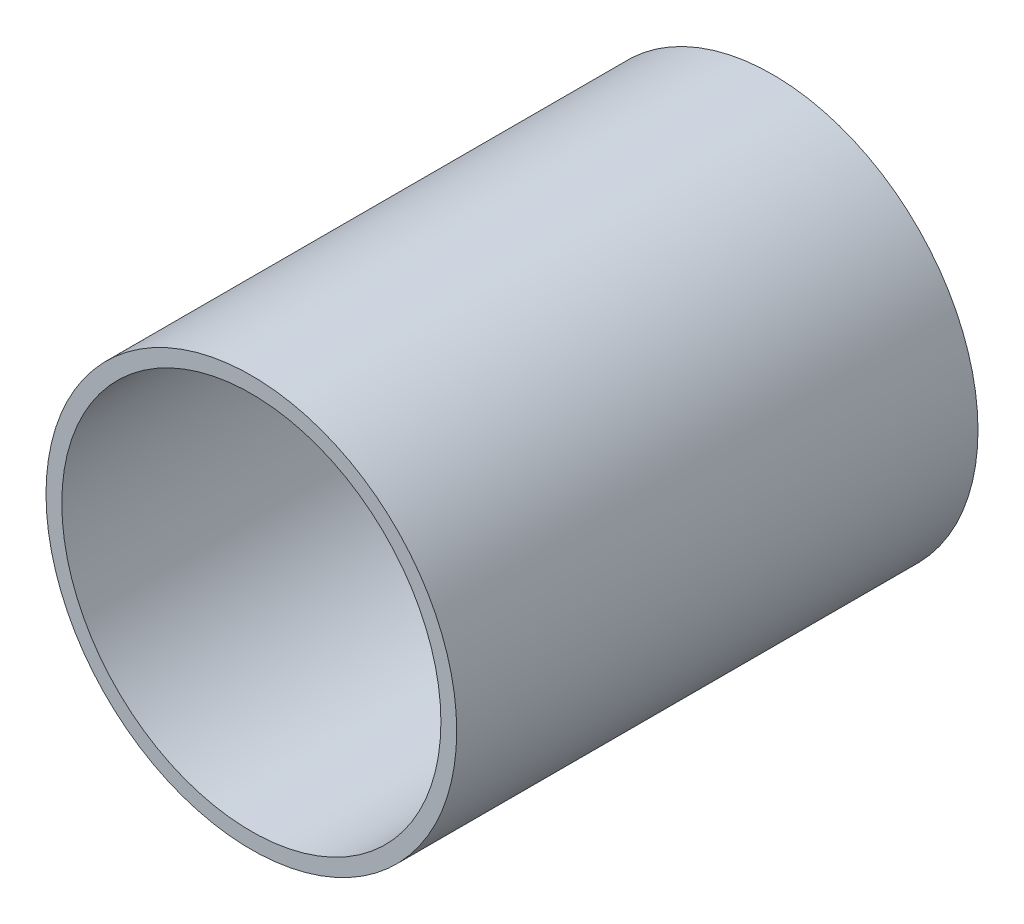
ISO-10303-21;
HEADER;
FILE_DESCRIPTION(('STEP AP214'),'2;1');
FILE_NAME('part.step','',(''),(''),'','','');
FILE_SCHEMA(('AUTOMOTIVE_DESIGN { 1 0 10303 214 1 1 1 1 }'));
ENDSEC;
DATA;
#1=APPLICATION_CONTEXT('core data for automotive mechanical design processes');
#2=APPLICATION_PROTOCOL_DEFINITION('international standard','automotive_design',2000,#1);
#3=PRODUCT_CONTEXT('',#1,'mechanical');
#4=PRODUCT('Part','Part','',(#3));
#5=PRODUCT_RELATED_PRODUCT_CATEGORY('part','',(#4));
#6=PRODUCT_DEFINITION_FORMATION('','',#4);
#7=PRODUCT_DEFINITION_CONTEXT('part definition',#1,'design');
#8=PRODUCT_DEFINITION('design','',#6,#7);
#9=PRODUCT_DEFINITION_SHAPE('','',#8);
#10=(LENGTH_UNIT() NAMED_UNIT(*) SI_UNIT(.MILLI.,.METRE.));
#11=(NAMED_UNIT(*) PLANE_ANGLE_UNIT() SI_UNIT($,.RADIAN.));
#12=(NAMED_UNIT(*) SI_UNIT($,.STERADIAN.) SOLID_ANGLE_UNIT());
#13=UNCERTAINTY_MEASURE_WITH_UNIT(LENGTH_MEASURE(1.E-05),#10,'distance_accuracy_value','');
#14=(GEOMETRIC_REPRESENTATION_CONTEXT(3) GLOBAL_UNCERTAINTY_ASSIGNED_CONTEXT((#13)) GLOBAL_UNIT_ASSIGNED_CONTEXT((#10,
#11,#12)) REPRESENTATION_CONTEXT('',''));
#15=CARTESIAN_POINT('',(0.,0.,0.));
#16=DIRECTION('',(0.,0.,1.));
#17=DIRECTION('',(1.,0.,0.));
#18=AXIS2_PLACEMENT_3D('',#15,#16,#17);
#19=CARTESIAN_POINT('',(0.,0.,104.775));
#20=DIRECTION('',(0.,0.,-1.));
#21=DIRECTION('',(-1.,0.,0.));
#22=AXIS2_PLACEMENT_3D('',#19,#20,#21);
#23=PLANE('',#22);
#24=CARTESIAN_POINT('',(0.,0.,104.775));
#25=DIRECTION('',(0.,0.,-1.));
#26=DIRECTION('',(-1.,0.,0.));
#27=AXIS2_PLACEMENT_3D('',#24,#25,#26);
#28=CIRCLE('',#27,82.55);
#29=CARTESIAN_POINT('',(-82.55,0.,104.775));
#30=VERTEX_POINT('',#29);
#31=EDGE_CURVE('E52',#30,#30,#28,.T.);
#32=ORIENTED_EDGE('',*,*,#31,.F.);
#33=EDGE_LOOP('',(#32));
#34=FACE_BOUND('',#33,.T.);
#35=CARTESIAN_POINT('',(0.,0.,104.775));
#36=DIRECTION('',(0.,0.,-1.));
#37=DIRECTION('',(-1.,0.,0.));
#38=AXIS2_PLACEMENT_3D('',#35,#36,#37);
#39=CIRCLE('',#38,76.2);
#40=CARTESIAN_POINT('',(-76.2,0.,104.775));
#41=VERTEX_POINT('',#40);
#42=EDGE_CURVE('E64',#41,#41,#39,.T.);
#43=ORIENTED_EDGE('',*,*,#42,.T.);
#44=EDGE_LOOP('',(#43));
#45=FACE_BOUND('',#44,.T.);
#46=ADVANCED_FACE('F42',(#34,#45),#23,.F.);
#47=CARTESIAN_POINT('',(0.,0.,-338.261659147798));
#48=DIRECTION('',(0.,0.,1.));
#49=DIRECTION('',(1.,0.,0.));
#50=AXIS2_PLACEMENT_3D('',#47,#48,#49);
#51=CYLINDRICAL_SURFACE('',#50,82.55);
#52=CARTESIAN_POINT('',(0.,0.,-104.775));
#53=DIRECTION('',(0.,0.,1.));
#54=DIRECTION('',(1.,0.,0.));
#55=AXIS2_PLACEMENT_3D('',#52,#53,#54);
#56=CIRCLE('',#55,82.55);
#57=CARTESIAN_POINT('',(82.55,0.,-104.775));
#58=VERTEX_POINT('',#57);
#59=EDGE_CURVE('E58',#58,#58,#56,.T.);
#60=ORIENTED_EDGE('',*,*,#59,.T.);
#61=EDGE_LOOP('',(#60));
#62=FACE_BOUND('',#61,.T.);
#63=ORIENTED_EDGE('',*,*,#31,.T.);
#64=EDGE_LOOP('',(#63));
#65=FACE_BOUND('',#64,.T.);
#66=ADVANCED_FACE('F76',(#62,#65),#51,.T.);
#67=CARTESIAN_POINT('',(0.,0.,-338.261659147798));
#68=DIRECTION('',(0.,0.,1.));
#69=DIRECTION('',(1.,0.,0.));
#70=AXIS2_PLACEMENT_3D('',#67,#68,#69);
#71=CYLINDRICAL_SURFACE('',#70,76.2);
#72=CARTESIAN_POINT('',(0.,0.,-104.775));
#73=DIRECTION('',(0.,0.,1.));
#74=DIRECTION('',(1.,0.,0.));
#75=AXIS2_PLACEMENT_3D('',#72,#73,#74);
#76=CIRCLE('',#75,76.2);
#77=CARTESIAN_POINT('',(76.2,0.,-104.775));
#78=VERTEX_POINT('',#77);
#79=EDGE_CURVE('E11',#78,#78,#76,.T.);
#80=ORIENTED_EDGE('',*,*,#79,.F.);
#81=EDGE_LOOP('',(#80));
#82=FACE_BOUND('',#81,.T.);
#83=ORIENTED_EDGE('',*,*,#42,.F.);
#84=EDGE_LOOP('',(#83));
#85=FACE_BOUND('',#84,.T.);
#86=ADVANCED_FACE('F74',(#82,#85),#71,.F.);
#87=CARTESIAN_POINT('',(82.55,0.,-104.775));
#88=DIRECTION('',(0.,0.,1.));
#89=DIRECTION('',(1.,0.,0.));
#90=AXIS2_PLACEMENT_3D('',#87,#88,#89);
#91=PLANE('',#90);
#92=ORIENTED_EDGE('',*,*,#79,.T.);
#93=EDGE_LOOP('',(#92));
#94=FACE_BOUND('',#93,.T.);
#95=ORIENTED_EDGE('',*,*,#59,.F.);
#96=EDGE_LOOP('',(#95));
#97=FACE_BOUND('',#96,.T.);
#98=ADVANCED_FACE('F45',(#94,#97),#91,.F.);
#99=CLOSED_SHELL('',(#46,#66,#86,#98));
#100=MANIFOLD_SOLID_BREP('B2',#99);
#101=ADVANCED_BREP_SHAPE_REPRESENTATION('',(#18,#100),#14);
#102=SHAPE_DEFINITION_REPRESENTATION(#9,#101);
ENDSEC;
END-ISO-10303-21;
